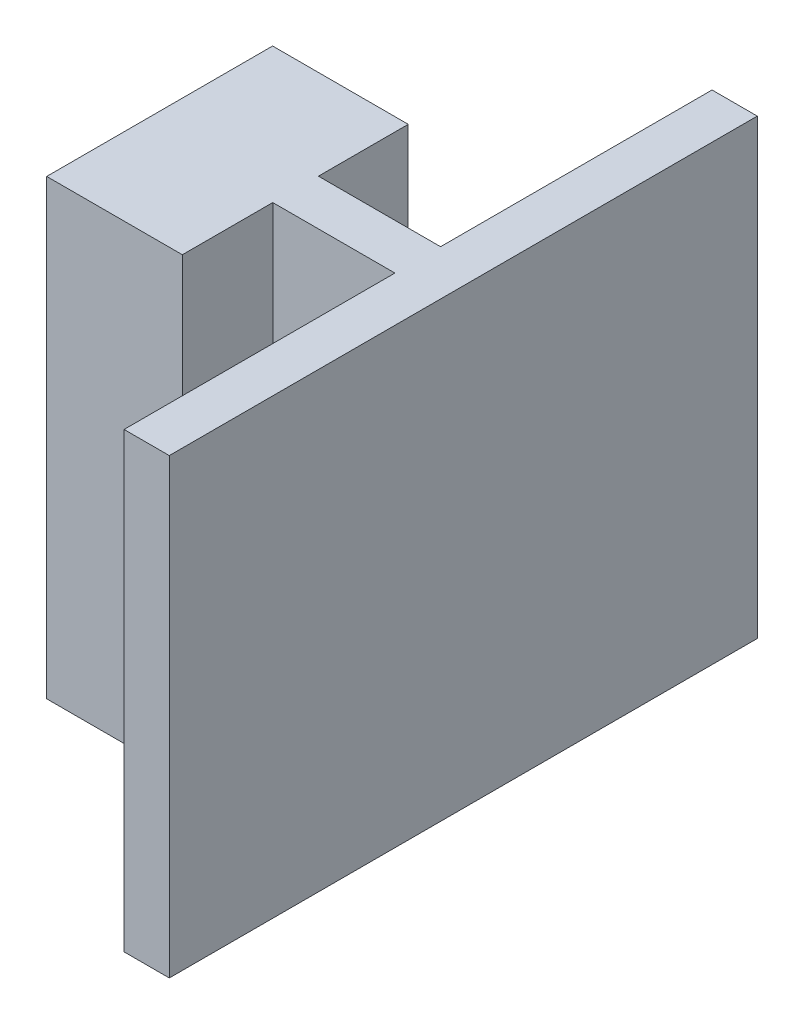
ISO-10303-21;
HEADER;
FILE_DESCRIPTION(('STEP AP214'),'2;1');
FILE_NAME('part.step','',(''),(''),'','','');
FILE_SCHEMA(('AUTOMOTIVE_DESIGN { 1 0 10303 214 1 1 1 1 }'));
ENDSEC;
DATA;
#1=APPLICATION_CONTEXT('core data for automotive mechanical design processes');
#2=APPLICATION_PROTOCOL_DEFINITION('international standard','automotive_design',2000,#1);
#3=PRODUCT_CONTEXT('',#1,'mechanical');
#4=PRODUCT('Part','Part','',(#3));
#5=PRODUCT_RELATED_PRODUCT_CATEGORY('part','',(#4));
#6=PRODUCT_DEFINITION_FORMATION('','',#4);
#7=PRODUCT_DEFINITION_CONTEXT('part definition',#1,'design');
#8=PRODUCT_DEFINITION('design','',#6,#7);
#9=PRODUCT_DEFINITION_SHAPE('','',#8);
#10=(LENGTH_UNIT() NAMED_UNIT(*) SI_UNIT(.MILLI.,.METRE.));
#11=(NAMED_UNIT(*) PLANE_ANGLE_UNIT() SI_UNIT($,.RADIAN.));
#12=(NAMED_UNIT(*) SI_UNIT($,.STERADIAN.) SOLID_ANGLE_UNIT());
#13=UNCERTAINTY_MEASURE_WITH_UNIT(LENGTH_MEASURE(1.E-05),#10,'distance_accuracy_value','');
#14=(GEOMETRIC_REPRESENTATION_CONTEXT(3) GLOBAL_UNCERTAINTY_ASSIGNED_CONTEXT((#13)) GLOBAL_UNIT_ASSIGNED_CONTEXT((#10,
#11,#12)) REPRESENTATION_CONTEXT('',''));
#15=CARTESIAN_POINT('',(0.,0.,0.));
#16=DIRECTION('',(0.,0.,1.));
#17=DIRECTION('',(1.,0.,0.));
#18=AXIS2_PLACEMENT_3D('',#15,#16,#17);
#19=CARTESIAN_POINT('',(34.29,127.,88.8492));
#20=DIRECTION('',(1.,0.,0.));
#21=DIRECTION('',(0.,0.,-1.));
#22=AXIS2_PLACEMENT_3D('',#19,#20,#21);
#23=PLANE('',#22);
#24=DIRECTION('',(0.,0.,1.));
#25=VECTOR('',#24,1.);
#26=CARTESIAN_POINT('',(34.29,0.,88.8492));
#27=LINE('',#26,#25);
#28=CARTESIAN_POINT('',(34.29,0.,12.8154545454545));
#29=VERTEX_POINT('',#28);
#30=CARTESIAN_POINT('',(34.29,0.,88.8492));
#31=VERTEX_POINT('',#30);
#32=EDGE_CURVE('E169',#29,#31,#27,.T.);
#33=ORIENTED_EDGE('',*,*,#32,.T.);
#34=DIRECTION('',(0.,-1.,0.));
#35=VECTOR('',#34,1.);
#36=CARTESIAN_POINT('',(34.29,127.,88.8492));
#37=LINE('',#36,#35);
#38=CARTESIAN_POINT('',(34.29,127.,88.8492));
#39=VERTEX_POINT('',#38);
#40=EDGE_CURVE('E11',#39,#31,#37,.T.);
#41=ORIENTED_EDGE('',*,*,#40,.F.);
#42=DIRECTION('',(0.,0.,1.));
#43=VECTOR('',#42,1.);
#44=CARTESIAN_POINT('',(34.29,127.,88.8492));
#45=LINE('',#44,#43);
#46=CARTESIAN_POINT('',(34.29,127.,12.8154545454545));
#47=VERTEX_POINT('',#46);
#48=EDGE_CURVE('E204',#47,#39,#45,.T.);
#49=ORIENTED_EDGE('',*,*,#48,.F.);
#50=DIRECTION('',(0.,-1.,0.));
#51=VECTOR('',#50,1.);
#52=CARTESIAN_POINT('',(34.29,127.,12.8154545454545));
#53=LINE('',#52,#51);
#54=EDGE_CURVE('E168',#47,#29,#53,.T.);
#55=ORIENTED_EDGE('',*,*,#54,.T.);
#56=EDGE_LOOP('',(#33,#41,#49,#55));
#57=FACE_BOUND('',#56,.T.);
#58=ADVANCED_FACE('F44',(#57),#23,.F.);
#59=CARTESIAN_POINT('',(46.99,127.,88.8492));
#60=DIRECTION('',(0.,0.,-1.));
#61=DIRECTION('',(-1.,0.,0.));
#62=AXIS2_PLACEMENT_3D('',#59,#60,#61);
#63=PLANE('',#62);
#64=DIRECTION('',(1.,0.,0.));
#65=VECTOR('',#64,1.);
#66=CARTESIAN_POINT('',(46.99,0.,88.8492));
#67=LINE('',#66,#65);
#68=CARTESIAN_POINT('',(46.99,0.,88.8492));
#69=VERTEX_POINT('',#68);
#70=EDGE_CURVE('E174',#31,#69,#67,.T.);
#71=ORIENTED_EDGE('',*,*,#70,.T.);
#72=DIRECTION('',(0.,-1.,0.));
#73=VECTOR('',#72,1.);
#74=CARTESIAN_POINT('',(46.99,127.,88.8492));
#75=LINE('',#74,#73);
#76=CARTESIAN_POINT('',(46.99,127.,88.8492));
#77=VERTEX_POINT('',#76);
#78=EDGE_CURVE('E53',#77,#69,#75,.T.);
#79=ORIENTED_EDGE('',*,*,#78,.F.);
#80=DIRECTION('',(1.,0.,0.));
#81=VECTOR('',#80,1.);
#82=CARTESIAN_POINT('',(46.99,127.,88.8492));
#83=LINE('',#82,#81);
#84=EDGE_CURVE('E117',#39,#77,#83,.T.);
#85=ORIENTED_EDGE('',*,*,#84,.F.);
#86=ORIENTED_EDGE('',*,*,#40,.T.);
#87=EDGE_LOOP('',(#71,#79,#85,#86));
#88=FACE_BOUND('',#87,.T.);
#89=ADVANCED_FACE('F299',(#88),#63,.F.);
#90=CARTESIAN_POINT('',(46.99,127.,-76.2));
#91=DIRECTION('',(-1.,0.,0.));
#92=DIRECTION('',(0.,0.,1.));
#93=AXIS2_PLACEMENT_3D('',#90,#91,#92);
#94=PLANE('',#93);
#95=DIRECTION('',(0.,0.,-1.));
#96=VECTOR('',#95,1.);
#97=CARTESIAN_POINT('',(46.99,0.,-76.2));
#98=LINE('',#97,#96);
#99=CARTESIAN_POINT('',(46.99,0.,-76.2));
#100=VERTEX_POINT('',#99);
#101=EDGE_CURVE('E180',#69,#100,#98,.T.);
#102=ORIENTED_EDGE('',*,*,#101,.T.);
#103=DIRECTION('',(0.,-1.,0.));
#104=VECTOR('',#103,1.);
#105=CARTESIAN_POINT('',(46.99,127.,-76.2));
#106=LINE('',#105,#104);
#107=CARTESIAN_POINT('',(46.99,127.,-76.2));
#108=VERTEX_POINT('',#107);
#109=EDGE_CURVE('E231',#108,#100,#106,.T.);
#110=ORIENTED_EDGE('',*,*,#109,.F.);
#111=DIRECTION('',(0.,0.,-1.));
#112=VECTOR('',#111,1.);
#113=CARTESIAN_POINT('',(46.99,127.,-76.2));
#114=LINE('',#113,#112);
#115=EDGE_CURVE('E241',#77,#108,#114,.T.);
#116=ORIENTED_EDGE('',*,*,#115,.F.);
#117=ORIENTED_EDGE('',*,*,#78,.T.);
#118=EDGE_LOOP('',(#102,#110,#116,#117));
#119=FACE_BOUND('',#118,.T.);
#120=ADVANCED_FACE('F236',(#119),#94,.F.);
#121=CARTESIAN_POINT('',(34.29,127.,-76.2));
#122=DIRECTION('',(0.,0.,1.));
#123=DIRECTION('',(1.,0.,0.));
#124=AXIS2_PLACEMENT_3D('',#121,#122,#123);
#125=PLANE('',#124);
#126=DIRECTION('',(-1.,0.,0.));
#127=VECTOR('',#126,1.);
#128=CARTESIAN_POINT('',(34.29,0.,-76.2));
#129=LINE('',#128,#127);
#130=CARTESIAN_POINT('',(34.29,0.,-76.2));
#131=VERTEX_POINT('',#130);
#132=EDGE_CURVE('E179',#100,#131,#129,.T.);
#133=ORIENTED_EDGE('',*,*,#132,.T.);
#134=DIRECTION('',(0.,-1.,0.));
#135=VECTOR('',#134,1.);
#136=CARTESIAN_POINT('',(34.29,127.,-76.2));
#137=LINE('',#136,#135);
#138=CARTESIAN_POINT('',(34.29,127.,-76.2));
#139=VERTEX_POINT('',#138);
#140=EDGE_CURVE('E230',#139,#131,#137,.T.);
#141=ORIENTED_EDGE('',*,*,#140,.F.);
#142=DIRECTION('',(-1.,0.,0.));
#143=VECTOR('',#142,1.);
#144=CARTESIAN_POINT('',(34.29,127.,-76.2));
#145=LINE('',#144,#143);
#146=EDGE_CURVE('E259',#108,#139,#145,.T.);
#147=ORIENTED_EDGE('',*,*,#146,.F.);
#148=ORIENTED_EDGE('',*,*,#109,.T.);
#149=EDGE_LOOP('',(#133,#141,#147,#148));
#150=FACE_BOUND('',#149,.T.);
#151=ADVANCED_FACE('F248',(#150),#125,.F.);
#152=CARTESIAN_POINT('',(34.29,127.,0.));
#153=DIRECTION('',(1.,0.,0.));
#154=DIRECTION('',(0.,0.,-1.));
#155=AXIS2_PLACEMENT_3D('',#152,#153,#154);
#156=PLANE('',#155);
#157=DIRECTION('',(0.,0.,1.));
#158=VECTOR('',#157,1.);
#159=CARTESIAN_POINT('',(34.29,0.,0.));
#160=LINE('',#159,#158);
#161=CARTESIAN_POINT('',(34.29,0.,0.));
#162=VERTEX_POINT('',#161);
#163=EDGE_CURVE('E183',#131,#162,#160,.T.);
#164=ORIENTED_EDGE('',*,*,#163,.T.);
#165=DIRECTION('',(0.,-1.,0.));
#166=VECTOR('',#165,1.);
#167=CARTESIAN_POINT('',(34.29,127.,0.));
#168=LINE('',#167,#166);
#169=CARTESIAN_POINT('',(34.29,127.,0.));
#170=VERTEX_POINT('',#169);
#171=EDGE_CURVE('E223',#170,#162,#168,.T.);
#172=ORIENTED_EDGE('',*,*,#171,.F.);
#173=DIRECTION('',(0.,0.,1.));
#174=VECTOR('',#173,1.);
#175=CARTESIAN_POINT('',(34.29,127.,0.));
#176=LINE('',#175,#174);
#177=EDGE_CURVE('E258',#139,#170,#176,.T.);
#178=ORIENTED_EDGE('',*,*,#177,.F.);
#179=ORIENTED_EDGE('',*,*,#140,.T.);
#180=EDGE_LOOP('',(#164,#172,#178,#179));
#181=FACE_BOUND('',#180,.T.);
#182=ADVANCED_FACE('F253',(#181),#156,.F.);
#183=CARTESIAN_POINT('',(0.,127.,0.));
#184=DIRECTION('',(0.,0.,1.));
#185=DIRECTION('',(1.,0.,0.));
#186=AXIS2_PLACEMENT_3D('',#183,#184,#185);
#187=PLANE('',#186);
#188=DIRECTION('',(-1.,0.,0.));
#189=VECTOR('',#188,1.);
#190=CARTESIAN_POINT('',(0.,0.,0.));
#191=LINE('',#190,#189);
#192=CARTESIAN_POINT('',(0.,0.,0.));
#193=VERTEX_POINT('',#192);
#194=EDGE_CURVE('E186',#162,#193,#191,.T.);
#195=ORIENTED_EDGE('',*,*,#194,.T.);
#196=DIRECTION('',(0.,-1.,0.));
#197=VECTOR('',#196,1.);
#198=CARTESIAN_POINT('',(0.,127.,0.));
#199=LINE('',#198,#197);
#200=CARTESIAN_POINT('',(0.,127.,0.));
#201=VERTEX_POINT('',#200);
#202=EDGE_CURVE('E219',#201,#193,#199,.T.);
#203=ORIENTED_EDGE('',*,*,#202,.F.);
#204=DIRECTION('',(-1.,0.,0.));
#205=VECTOR('',#204,1.);
#206=CARTESIAN_POINT('',(0.,127.,0.));
#207=LINE('',#206,#205);
#208=EDGE_CURVE('E260',#170,#201,#207,.T.);
#209=ORIENTED_EDGE('',*,*,#208,.F.);
#210=ORIENTED_EDGE('',*,*,#171,.T.);
#211=EDGE_LOOP('',(#195,#203,#209,#210));
#212=FACE_BOUND('',#211,.T.);
#213=ADVANCED_FACE('F311',(#212),#187,.F.);
#214=CARTESIAN_POINT('',(0.,127.,-25.2134254545455));
#215=DIRECTION('',(-1.,0.,0.));
#216=DIRECTION('',(0.,0.,1.));
#217=AXIS2_PLACEMENT_3D('',#214,#215,#216);
#218=PLANE('',#217);
#219=DIRECTION('',(0.,0.,-1.));
#220=VECTOR('',#219,1.);
#221=CARTESIAN_POINT('',(0.,0.,-25.2134254545455));
#222=LINE('',#221,#220);
#223=CARTESIAN_POINT('',(0.,0.,-25.2134254545455));
#224=VERTEX_POINT('',#223);
#225=EDGE_CURVE('E188',#193,#224,#222,.T.);
#226=ORIENTED_EDGE('',*,*,#225,.T.);
#227=DIRECTION('',(0.,-1.,0.));
#228=VECTOR('',#227,1.);
#229=CARTESIAN_POINT('',(0.,127.,-25.2134254545455));
#230=LINE('',#229,#228);
#231=CARTESIAN_POINT('',(0.,127.,-25.2134254545455));
#232=VERTEX_POINT('',#231);
#233=EDGE_CURVE('E214',#232,#224,#230,.T.);
#234=ORIENTED_EDGE('',*,*,#233,.F.);
#235=DIRECTION('',(0.,0.,-1.));
#236=VECTOR('',#235,1.);
#237=CARTESIAN_POINT('',(0.,127.,-25.2134254545455));
#238=LINE('',#237,#236);
#239=EDGE_CURVE('E264',#201,#232,#238,.T.);
#240=ORIENTED_EDGE('',*,*,#239,.F.);
#241=ORIENTED_EDGE('',*,*,#202,.T.);
#242=EDGE_LOOP('',(#226,#234,#240,#241));
#243=FACE_BOUND('',#242,.T.);
#244=ADVANCED_FACE('F312',(#243),#218,.F.);
#245=CARTESIAN_POINT('',(-38.0746,127.,-25.2134254545455));
#246=DIRECTION('',(0.,0.,1.));
#247=DIRECTION('',(1.,0.,0.));
#248=AXIS2_PLACEMENT_3D('',#245,#246,#247);
#249=PLANE('',#248);
#250=DIRECTION('',(-1.,0.,0.));
#251=VECTOR('',#250,1.);
#252=CARTESIAN_POINT('',(-38.0746,0.,-25.2134254545455));
#253=LINE('',#252,#251);
#254=CARTESIAN_POINT('',(-38.0746,0.,-25.2134254545455));
#255=VERTEX_POINT('',#254);
#256=EDGE_CURVE('E195',#224,#255,#253,.T.);
#257=ORIENTED_EDGE('',*,*,#256,.T.);
#258=DIRECTION('',(0.,-1.,0.));
#259=VECTOR('',#258,1.);
#260=CARTESIAN_POINT('',(-38.0746,127.,-25.2134254545455));
#261=LINE('',#260,#259);
#262=CARTESIAN_POINT('',(-38.0746,127.,-25.2134254545455));
#263=VERTEX_POINT('',#262);
#264=EDGE_CURVE('E213',#263,#255,#261,.T.);
#265=ORIENTED_EDGE('',*,*,#264,.F.);
#266=DIRECTION('',(-1.,0.,0.));
#267=VECTOR('',#266,1.);
#268=CARTESIAN_POINT('',(-38.0746,127.,-25.2134254545455));
#269=LINE('',#268,#267);
#270=EDGE_CURVE('E271',#232,#263,#269,.T.);
#271=ORIENTED_EDGE('',*,*,#270,.F.);
#272=ORIENTED_EDGE('',*,*,#233,.T.);
#273=EDGE_LOOP('',(#257,#265,#271,#272));
#274=FACE_BOUND('',#273,.T.);
#275=ADVANCED_FACE('F278',(#274),#249,.F.);
#276=CARTESIAN_POINT('',(-38.0746,127.,38.1951345454546));
#277=DIRECTION('',(1.,0.,0.));
#278=DIRECTION('',(0.,0.,-1.));
#279=AXIS2_PLACEMENT_3D('',#276,#277,#278);
#280=PLANE('',#279);
#281=DIRECTION('',(0.,0.,1.));
#282=VECTOR('',#281,1.);
#283=CARTESIAN_POINT('',(-38.0746,0.,38.1951345454546));
#284=LINE('',#283,#282);
#285=CARTESIAN_POINT('',(-38.0746,0.,38.1951345454546));
#286=VERTEX_POINT('',#285);
#287=EDGE_CURVE('E193',#255,#286,#284,.T.);
#288=ORIENTED_EDGE('',*,*,#287,.T.);
#289=DIRECTION('',(0.,-1.,0.));
#290=VECTOR('',#289,1.);
#291=CARTESIAN_POINT('',(-38.0746,127.,38.1951345454546));
#292=LINE('',#291,#290);
#293=CARTESIAN_POINT('',(-38.0746,127.,38.1951345454546));
#294=VERTEX_POINT('',#293);
#295=EDGE_CURVE('E159',#294,#286,#292,.T.);
#296=ORIENTED_EDGE('',*,*,#295,.F.);
#297=DIRECTION('',(0.,0.,1.));
#298=VECTOR('',#297,1.);
#299=CARTESIAN_POINT('',(-38.0746,127.,38.1951345454546));
#300=LINE('',#299,#298);
#301=EDGE_CURVE('E149',#263,#294,#300,.T.);
#302=ORIENTED_EDGE('',*,*,#301,.F.);
#303=ORIENTED_EDGE('',*,*,#264,.T.);
#304=EDGE_LOOP('',(#288,#296,#302,#303));
#305=FACE_BOUND('',#304,.T.);
#306=ADVANCED_FACE('F284',(#305),#280,.F.);
#307=CARTESIAN_POINT('',(0.,127.,38.1951345454546));
#308=DIRECTION('',(0.,0.,-1.));
#309=DIRECTION('',(-1.,0.,0.));
#310=AXIS2_PLACEMENT_3D('',#307,#308,#309);
#311=PLANE('',#310);
#312=DIRECTION('',(1.,0.,0.));
#313=VECTOR('',#312,1.);
#314=CARTESIAN_POINT('',(0.,0.,38.1951345454546));
#315=LINE('',#314,#313);
#316=CARTESIAN_POINT('',(0.,0.,38.1951345454546));
#317=VERTEX_POINT('',#316);
#318=EDGE_CURVE('E160',#286,#317,#315,.T.);
#319=ORIENTED_EDGE('',*,*,#318,.T.);
#320=DIRECTION('',(0.,-1.,0.));
#321=VECTOR('',#320,1.);
#322=CARTESIAN_POINT('',(0.,127.,38.1951345454546));
#323=LINE('',#322,#321);
#324=CARTESIAN_POINT('',(0.,127.,38.1951345454546));
#325=VERTEX_POINT('',#324);
#326=EDGE_CURVE('E153',#325,#317,#323,.T.);
#327=ORIENTED_EDGE('',*,*,#326,.F.);
#328=DIRECTION('',(1.,0.,0.));
#329=VECTOR('',#328,1.);
#330=CARTESIAN_POINT('',(0.,127.,38.1951345454546));
#331=LINE('',#330,#329);
#332=EDGE_CURVE('E145',#294,#325,#331,.T.);
#333=ORIENTED_EDGE('',*,*,#332,.F.);
#334=ORIENTED_EDGE('',*,*,#295,.T.);
#335=EDGE_LOOP('',(#319,#327,#333,#334));
#336=FACE_BOUND('',#335,.T.);
#337=ADVANCED_FACE('F155',(#336),#311,.F.);
#338=CARTESIAN_POINT('',(0.,127.,12.8154545454545));
#339=DIRECTION('',(-1.,0.,0.));
#340=DIRECTION('',(0.,0.,1.));
#341=AXIS2_PLACEMENT_3D('',#338,#339,#340);
#342=PLANE('',#341);
#343=DIRECTION('',(0.,0.,-1.));
#344=VECTOR('',#343,1.);
#345=CARTESIAN_POINT('',(0.,0.,12.8154545454545));
#346=LINE('',#345,#344);
#347=CARTESIAN_POINT('',(0.,0.,12.8154545454545));
#348=VERTEX_POINT('',#347);
#349=EDGE_CURVE('E104',#317,#348,#346,.T.);
#350=ORIENTED_EDGE('',*,*,#349,.T.);
#351=DIRECTION('',(0.,-1.,0.));
#352=VECTOR('',#351,1.);
#353=CARTESIAN_POINT('',(0.,127.,12.8154545454545));
#354=LINE('',#353,#352);
#355=CARTESIAN_POINT('',(0.,127.,12.8154545454545));
#356=VERTEX_POINT('',#355);
#357=EDGE_CURVE('E158',#356,#348,#354,.T.);
#358=ORIENTED_EDGE('',*,*,#357,.F.);
#359=DIRECTION('',(0.,0.,-1.));
#360=VECTOR('',#359,1.);
#361=CARTESIAN_POINT('',(0.,127.,12.8154545454545));
#362=LINE('',#361,#360);
#363=EDGE_CURVE('E147',#325,#356,#362,.T.);
#364=ORIENTED_EDGE('',*,*,#363,.F.);
#365=ORIENTED_EDGE('',*,*,#326,.T.);
#366=EDGE_LOOP('',(#350,#358,#364,#365));
#367=FACE_BOUND('',#366,.T.);
#368=ADVANCED_FACE('F162',(#367),#342,.F.);
#369=CARTESIAN_POINT('',(34.29,127.,12.8154545454545));
#370=DIRECTION('',(0.,0.,-1.));
#371=DIRECTION('',(-1.,0.,0.));
#372=AXIS2_PLACEMENT_3D('',#369,#370,#371);
#373=PLANE('',#372);
#374=DIRECTION('',(1.,0.,0.));
#375=VECTOR('',#374,1.);
#376=CARTESIAN_POINT('',(34.29,0.,12.8154545454545));
#377=LINE('',#376,#375);
#378=EDGE_CURVE('E108',#348,#29,#377,.T.);
#379=ORIENTED_EDGE('',*,*,#378,.T.);
#380=ORIENTED_EDGE('',*,*,#54,.F.);
#381=DIRECTION('',(1.,0.,0.));
#382=VECTOR('',#381,1.);
#383=CARTESIAN_POINT('',(34.29,127.,12.8154545454545));
#384=LINE('',#383,#382);
#385=EDGE_CURVE('E62',#356,#47,#384,.T.);
#386=ORIENTED_EDGE('',*,*,#385,.F.);
#387=ORIENTED_EDGE('',*,*,#357,.T.);
#388=EDGE_LOOP('',(#379,#380,#386,#387));
#389=FACE_BOUND('',#388,.T.);
#390=ADVANCED_FACE('F287',(#389),#373,.F.);
#391=CARTESIAN_POINT('',(0.,127.,0.));
#392=DIRECTION('',(0.,1.,0.));
#393=DIRECTION('',(0.,0.,1.));
#394=AXIS2_PLACEMENT_3D('',#391,#392,#393);
#395=PLANE('',#394);
#396=ORIENTED_EDGE('',*,*,#48,.T.);
#397=ORIENTED_EDGE('',*,*,#84,.T.);
#398=ORIENTED_EDGE('',*,*,#115,.T.);
#399=ORIENTED_EDGE('',*,*,#146,.T.);
#400=ORIENTED_EDGE('',*,*,#177,.T.);
#401=ORIENTED_EDGE('',*,*,#208,.T.);
#402=ORIENTED_EDGE('',*,*,#239,.T.);
#403=ORIENTED_EDGE('',*,*,#270,.T.);
#404=ORIENTED_EDGE('',*,*,#301,.T.);
#405=ORIENTED_EDGE('',*,*,#332,.T.);
#406=ORIENTED_EDGE('',*,*,#363,.T.);
#407=ORIENTED_EDGE('',*,*,#385,.T.);
#408=EDGE_LOOP('',(#396,#397,#398,#399,#400,#401,#402,#403,#404,#405,#406,#407));
#409=FACE_BOUND('',#408,.T.);
#410=ADVANCED_FACE('F143',(#409),#395,.T.);
#411=CARTESIAN_POINT('',(0.,0.,0.));
#412=DIRECTION('',(0.,1.,0.));
#413=DIRECTION('',(0.,0.,1.));
#414=AXIS2_PLACEMENT_3D('',#411,#412,#413);
#415=PLANE('',#414);
#416=ORIENTED_EDGE('',*,*,#32,.F.);
#417=ORIENTED_EDGE('',*,*,#378,.F.);
#418=ORIENTED_EDGE('',*,*,#349,.F.);
#419=ORIENTED_EDGE('',*,*,#318,.F.);
#420=ORIENTED_EDGE('',*,*,#287,.F.);
#421=ORIENTED_EDGE('',*,*,#256,.F.);
#422=ORIENTED_EDGE('',*,*,#225,.F.);
#423=ORIENTED_EDGE('',*,*,#194,.F.);
#424=ORIENTED_EDGE('',*,*,#163,.F.);
#425=ORIENTED_EDGE('',*,*,#132,.F.);
#426=ORIENTED_EDGE('',*,*,#101,.F.);
#427=ORIENTED_EDGE('',*,*,#70,.F.);
#428=EDGE_LOOP('',(#416,#417,#418,#419,#420,#421,#422,#423,#424,#425,#426,#427));
#429=FACE_BOUND('',#428,.T.);
#430=ADVANCED_FACE('F245',(#429),#415,.F.);
#431=CLOSED_SHELL('',(#58,#89,#120,#151,#182,#213,#244,#275,#306,#337,#368,#390,#410,#430));
#432=MANIFOLD_SOLID_BREP('B2',#431);
#433=ADVANCED_BREP_SHAPE_REPRESENTATION('',(#18,#432),#14);
#434=SHAPE_DEFINITION_REPRESENTATION(#9,#433);
ENDSEC;
END-ISO-10303-21;
